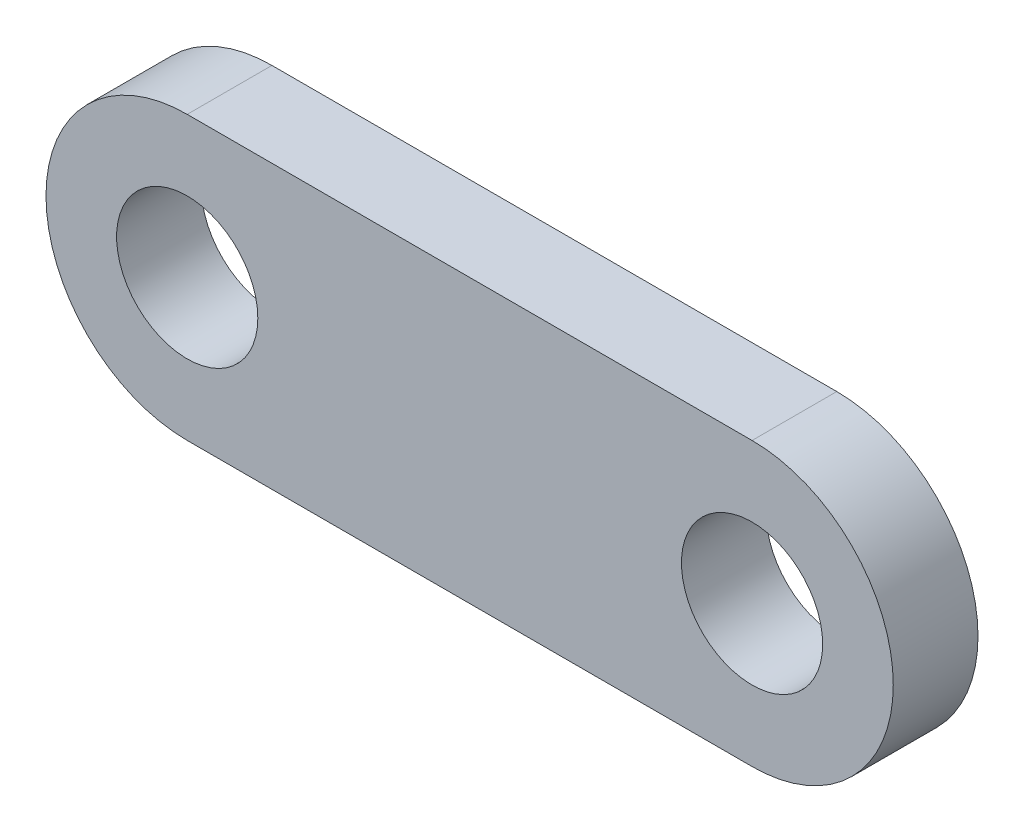
ISO-10303-21;
HEADER;
FILE_DESCRIPTION(('STEP AP214'),'2;1');
FILE_NAME('part.step','',(''),(''),'','','');
FILE_SCHEMA(('AUTOMOTIVE_DESIGN { 1 0 10303 214 1 1 1 1 }'));
ENDSEC;
DATA;
#1=APPLICATION_CONTEXT('core data for automotive mechanical design processes');
#2=APPLICATION_PROTOCOL_DEFINITION('international standard','automotive_design',2000,#1);
#3=PRODUCT_CONTEXT('',#1,'mechanical');
#4=PRODUCT('Part','Part','',(#3));
#5=PRODUCT_RELATED_PRODUCT_CATEGORY('part','',(#4));
#6=PRODUCT_DEFINITION_FORMATION('','',#4);
#7=PRODUCT_DEFINITION_CONTEXT('part definition',#1,'design');
#8=PRODUCT_DEFINITION('design','',#6,#7);
#9=PRODUCT_DEFINITION_SHAPE('','',#8);
#10=(LENGTH_UNIT() NAMED_UNIT(*) SI_UNIT(.MILLI.,.METRE.));
#11=(NAMED_UNIT(*) PLANE_ANGLE_UNIT() SI_UNIT($,.RADIAN.));
#12=(NAMED_UNIT(*) SI_UNIT($,.STERADIAN.) SOLID_ANGLE_UNIT());
#13=UNCERTAINTY_MEASURE_WITH_UNIT(LENGTH_MEASURE(1.E-05),#10,'distance_accuracy_value','');
#14=(GEOMETRIC_REPRESENTATION_CONTEXT(3) GLOBAL_UNCERTAINTY_ASSIGNED_CONTEXT((#13)) GLOBAL_UNIT_ASSIGNED_CONTEXT((#10,
#11,#12)) REPRESENTATION_CONTEXT('',''));
#15=CARTESIAN_POINT('',(0.,0.,0.));
#16=DIRECTION('',(0.,0.,1.));
#17=DIRECTION('',(1.,0.,0.));
#18=AXIS2_PLACEMENT_3D('',#15,#16,#17);
#19=CARTESIAN_POINT('',(-10.,0.,3.));
#20=DIRECTION('',(0.,0.,1.));
#21=DIRECTION('',(1.,0.,0.));
#22=AXIS2_PLACEMENT_3D('',#19,#20,#21);
#23=PLANE('',#22);
#24=CARTESIAN_POINT('',(-10.,0.,3.));
#25=DIRECTION('',(0.,0.,1.));
#26=DIRECTION('',(1.,0.,0.));
#27=AXIS2_PLACEMENT_3D('',#24,#25,#26);
#28=CIRCLE('',#27,2.5);
#29=CARTESIAN_POINT('',(-7.5,0.,3.));
#30=VERTEX_POINT('',#29);
#31=EDGE_CURVE('E100',#30,#30,#28,.T.);
#32=ORIENTED_EDGE('',*,*,#31,.F.);
#33=EDGE_LOOP('',(#32));
#34=FACE_BOUND('',#33,.T.);
#35=CARTESIAN_POINT('',(-10.,0.,3.));
#36=DIRECTION('',(0.,0.,1.));
#37=DIRECTION('',(1.,0.,0.));
#38=AXIS2_PLACEMENT_3D('',#35,#36,#37);
#39=CIRCLE('',#38,5.);
#40=CARTESIAN_POINT('',(-10.,5.,3.));
#41=VERTEX_POINT('',#40);
#42=CARTESIAN_POINT('',(-10.,-5.,3.));
#43=VERTEX_POINT('',#42);
#44=EDGE_CURVE('E85',#41,#43,#39,.T.);
#45=ORIENTED_EDGE('',*,*,#44,.T.);
#46=DIRECTION('',(1.,0.,0.));
#47=VECTOR('',#46,1.);
#48=CARTESIAN_POINT('',(-10.,-5.,3.));
#49=LINE('',#48,#47);
#50=CARTESIAN_POINT('',(10.,-5.,3.));
#51=VERTEX_POINT('',#50);
#52=EDGE_CURVE('E80',#43,#51,#49,.T.);
#53=ORIENTED_EDGE('',*,*,#52,.T.);
#54=CARTESIAN_POINT('',(10.,0.,3.));
#55=DIRECTION('',(0.,0.,1.));
#56=DIRECTION('',(1.,0.,0.));
#57=AXIS2_PLACEMENT_3D('',#54,#55,#56);
#58=CIRCLE('',#57,5.);
#59=CARTESIAN_POINT('',(10.,5.,3.));
#60=VERTEX_POINT('',#59);
#61=EDGE_CURVE('E83',#51,#60,#58,.T.);
#62=ORIENTED_EDGE('',*,*,#61,.T.);
#63=DIRECTION('',(-1.,0.,0.));
#64=VECTOR('',#63,1.);
#65=CARTESIAN_POINT('',(-10.,5.,3.));
#66=LINE('',#65,#64);
#67=EDGE_CURVE('E50',#60,#41,#66,.T.);
#68=ORIENTED_EDGE('',*,*,#67,.T.);
#69=EDGE_LOOP('',(#45,#53,#62,#68));
#70=FACE_BOUND('',#69,.T.);
#71=CARTESIAN_POINT('',(10.,0.,3.));
#72=DIRECTION('',(0.,0.,1.));
#73=DIRECTION('',(1.,0.,0.));
#74=AXIS2_PLACEMENT_3D('',#71,#72,#73);
#75=CIRCLE('',#74,2.5);
#76=CARTESIAN_POINT('',(12.5,0.,3.));
#77=VERTEX_POINT('',#76);
#78=EDGE_CURVE('E115',#77,#77,#75,.T.);
#79=ORIENTED_EDGE('',*,*,#78,.F.);
#80=EDGE_LOOP('',(#79));
#81=FACE_BOUND('',#80,.T.);
#82=ADVANCED_FACE('F33',(#34,#70,#81),#23,.T.);
#83=CARTESIAN_POINT('',(-10.,0.,0.));
#84=DIRECTION('',(0.,0.,1.));
#85=DIRECTION('',(1.,0.,0.));
#86=AXIS2_PLACEMENT_3D('',#83,#84,#85);
#87=PLANE('',#86);
#88=CARTESIAN_POINT('',(-10.,0.,0.));
#89=DIRECTION('',(0.,0.,1.));
#90=DIRECTION('',(1.,0.,0.));
#91=AXIS2_PLACEMENT_3D('',#88,#89,#90);
#92=CIRCLE('',#91,5.);
#93=CARTESIAN_POINT('',(-10.,5.,0.));
#94=VERTEX_POINT('',#93);
#95=CARTESIAN_POINT('',(-10.,-5.,0.));
#96=VERTEX_POINT('',#95);
#97=EDGE_CURVE('E97',#94,#96,#92,.T.);
#98=ORIENTED_EDGE('',*,*,#97,.F.);
#99=DIRECTION('',(-1.,0.,0.));
#100=VECTOR('',#99,1.);
#101=CARTESIAN_POINT('',(-10.,5.,0.));
#102=LINE('',#101,#100);
#103=CARTESIAN_POINT('',(10.,5.,0.));
#104=VERTEX_POINT('',#103);
#105=EDGE_CURVE('E73',#104,#94,#102,.T.);
#106=ORIENTED_EDGE('',*,*,#105,.F.);
#107=CARTESIAN_POINT('',(10.,0.,0.));
#108=DIRECTION('',(0.,0.,1.));
#109=DIRECTION('',(1.,0.,0.));
#110=AXIS2_PLACEMENT_3D('',#107,#108,#109);
#111=CIRCLE('',#110,5.);
#112=CARTESIAN_POINT('',(10.,-5.,0.));
#113=VERTEX_POINT('',#112);
#114=EDGE_CURVE('E67',#113,#104,#111,.T.);
#115=ORIENTED_EDGE('',*,*,#114,.F.);
#116=DIRECTION('',(1.,0.,0.));
#117=VECTOR('',#116,1.);
#118=CARTESIAN_POINT('',(-10.,-5.,0.));
#119=LINE('',#118,#117);
#120=EDGE_CURVE('E89',#96,#113,#119,.T.);
#121=ORIENTED_EDGE('',*,*,#120,.F.);
#122=EDGE_LOOP('',(#98,#106,#115,#121));
#123=FACE_BOUND('',#122,.T.);
#124=CARTESIAN_POINT('',(-10.,0.,0.));
#125=DIRECTION('',(0.,0.,1.));
#126=DIRECTION('',(1.,0.,0.));
#127=AXIS2_PLACEMENT_3D('',#124,#125,#126);
#128=CIRCLE('',#127,2.5);
#129=CARTESIAN_POINT('',(-7.5,0.,0.));
#130=VERTEX_POINT('',#129);
#131=EDGE_CURVE('E112',#130,#130,#128,.T.);
#132=ORIENTED_EDGE('',*,*,#131,.T.);
#133=EDGE_LOOP('',(#132));
#134=FACE_BOUND('',#133,.T.);
#135=CARTESIAN_POINT('',(10.,0.,0.));
#136=DIRECTION('',(0.,0.,1.));
#137=DIRECTION('',(1.,0.,0.));
#138=AXIS2_PLACEMENT_3D('',#135,#136,#137);
#139=CIRCLE('',#138,2.5);
#140=CARTESIAN_POINT('',(12.5,0.,0.));
#141=VERTEX_POINT('',#140);
#142=EDGE_CURVE('E118',#141,#141,#139,.T.);
#143=ORIENTED_EDGE('',*,*,#142,.T.);
#144=EDGE_LOOP('',(#143));
#145=FACE_BOUND('',#144,.T.);
#146=ADVANCED_FACE('F108',(#123,#134,#145),#87,.F.);
#147=CARTESIAN_POINT('',(-10.,0.,3.));
#148=DIRECTION('',(0.,0.,-1.));
#149=DIRECTION('',(-1.,0.,0.));
#150=AXIS2_PLACEMENT_3D('',#147,#148,#149);
#151=CYLINDRICAL_SURFACE('',#150,5.);
#152=ORIENTED_EDGE('',*,*,#97,.T.);
#153=DIRECTION('',(0.,0.,-1.));
#154=VECTOR('',#153,1.);
#155=CARTESIAN_POINT('',(-10.,-5.,3.));
#156=LINE('',#155,#154);
#157=EDGE_CURVE('E11',#43,#96,#156,.T.);
#158=ORIENTED_EDGE('',*,*,#157,.F.);
#159=ORIENTED_EDGE('',*,*,#44,.F.);
#160=DIRECTION('',(0.,0.,-1.));
#161=VECTOR('',#160,1.);
#162=CARTESIAN_POINT('',(-10.,5.,3.));
#163=LINE('',#162,#161);
#164=EDGE_CURVE('E93',#41,#94,#163,.T.);
#165=ORIENTED_EDGE('',*,*,#164,.T.);
#166=EDGE_LOOP('',(#152,#158,#159,#165));
#167=FACE_BOUND('',#166,.T.);
#168=ADVANCED_FACE('F35',(#167),#151,.T.);
#169=CARTESIAN_POINT('',(-10.,-5.,3.));
#170=DIRECTION('',(0.,1.,0.));
#171=DIRECTION('',(0.,0.,1.));
#172=AXIS2_PLACEMENT_3D('',#169,#170,#171);
#173=PLANE('',#172);
#174=ORIENTED_EDGE('',*,*,#120,.T.);
#175=DIRECTION('',(0.,0.,-1.));
#176=VECTOR('',#175,1.);
#177=CARTESIAN_POINT('',(10.,-5.,3.));
#178=LINE('',#177,#176);
#179=EDGE_CURVE('E42',#51,#113,#178,.T.);
#180=ORIENTED_EDGE('',*,*,#179,.F.);
#181=ORIENTED_EDGE('',*,*,#52,.F.);
#182=ORIENTED_EDGE('',*,*,#157,.T.);
#183=EDGE_LOOP('',(#174,#180,#181,#182));
#184=FACE_BOUND('',#183,.T.);
#185=ADVANCED_FACE('F88',(#184),#173,.F.);
#186=CARTESIAN_POINT('',(10.,0.,3.));
#187=DIRECTION('',(0.,0.,-1.));
#188=DIRECTION('',(-1.,0.,0.));
#189=AXIS2_PLACEMENT_3D('',#186,#187,#188);
#190=CYLINDRICAL_SURFACE('',#189,5.);
#191=ORIENTED_EDGE('',*,*,#114,.T.);
#192=DIRECTION('',(0.,0.,-1.));
#193=VECTOR('',#192,1.);
#194=CARTESIAN_POINT('',(10.,5.,3.));
#195=LINE('',#194,#193);
#196=EDGE_CURVE('E90',#60,#104,#195,.T.);
#197=ORIENTED_EDGE('',*,*,#196,.F.);
#198=ORIENTED_EDGE('',*,*,#61,.F.);
#199=ORIENTED_EDGE('',*,*,#179,.T.);
#200=EDGE_LOOP('',(#191,#197,#198,#199));
#201=FACE_BOUND('',#200,.T.);
#202=ADVANCED_FACE('F91',(#201),#190,.T.);
#203=CARTESIAN_POINT('',(-10.,5.,3.));
#204=DIRECTION('',(0.,-1.,0.));
#205=DIRECTION('',(0.,0.,-1.));
#206=AXIS2_PLACEMENT_3D('',#203,#204,#205);
#207=PLANE('',#206);
#208=ORIENTED_EDGE('',*,*,#105,.T.);
#209=ORIENTED_EDGE('',*,*,#164,.F.);
#210=ORIENTED_EDGE('',*,*,#67,.F.);
#211=ORIENTED_EDGE('',*,*,#196,.T.);
#212=EDGE_LOOP('',(#208,#209,#210,#211));
#213=FACE_BOUND('',#212,.T.);
#214=ADVANCED_FACE('F105',(#213),#207,.F.);
#215=CARTESIAN_POINT('',(-10.,0.,3.));
#216=DIRECTION('',(0.,0.,-1.));
#217=DIRECTION('',(-1.,0.,0.));
#218=AXIS2_PLACEMENT_3D('',#215,#216,#217);
#219=CYLINDRICAL_SURFACE('',#218,2.5);
#220=ORIENTED_EDGE('',*,*,#31,.T.);
#221=EDGE_LOOP('',(#220));
#222=FACE_BOUND('',#221,.T.);
#223=ORIENTED_EDGE('',*,*,#131,.F.);
#224=EDGE_LOOP('',(#223));
#225=FACE_BOUND('',#224,.T.);
#226=ADVANCED_FACE('F135',(#222,#225),#219,.F.);
#227=CARTESIAN_POINT('',(10.,0.,3.));
#228=DIRECTION('',(0.,0.,-1.));
#229=DIRECTION('',(-1.,0.,0.));
#230=AXIS2_PLACEMENT_3D('',#227,#228,#229);
#231=CYLINDRICAL_SURFACE('',#230,2.5);
#232=ORIENTED_EDGE('',*,*,#78,.T.);
#233=EDGE_LOOP('',(#232));
#234=FACE_BOUND('',#233,.T.);
#235=ORIENTED_EDGE('',*,*,#142,.F.);
#236=EDGE_LOOP('',(#235));
#237=FACE_BOUND('',#236,.T.);
#238=ADVANCED_FACE('F124',(#234,#237),#231,.F.);
#239=CLOSED_SHELL('',(#82,#146,#168,#185,#202,#214,#226,#238));
#240=MANIFOLD_SOLID_BREP('B2',#239);
#241=ADVANCED_BREP_SHAPE_REPRESENTATION('',(#18,#240),#14);
#242=SHAPE_DEFINITION_REPRESENTATION(#9,#241);
ENDSEC;
END-ISO-10303-21;
